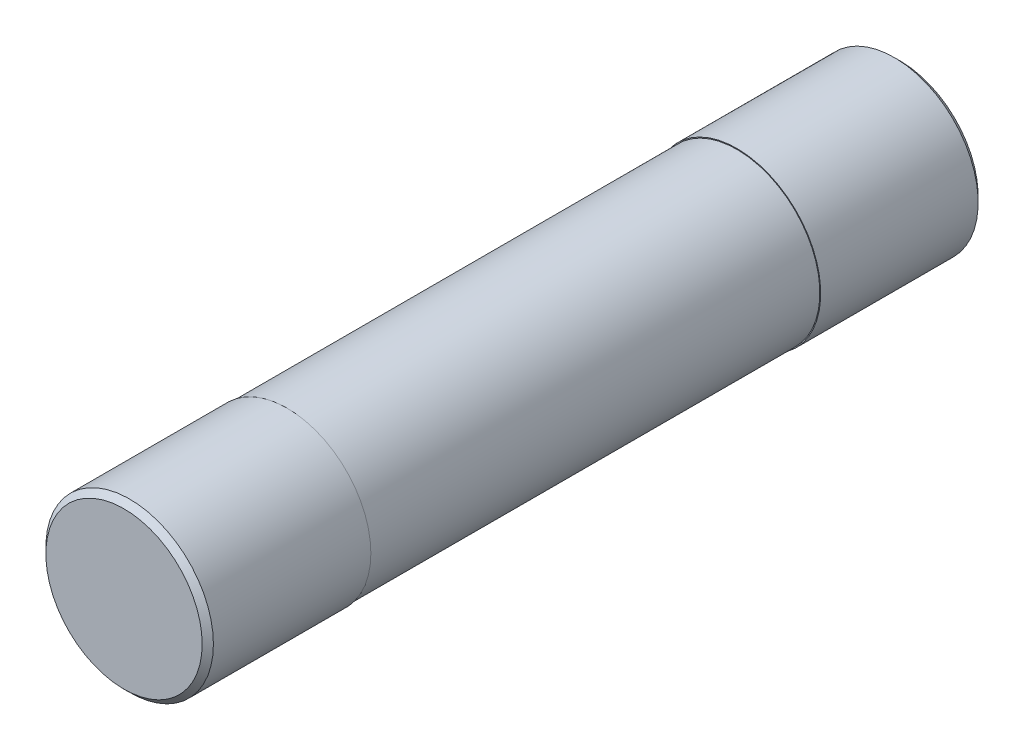
ISO-10303-21;
HEADER;
FILE_DESCRIPTION(('STEP AP214'),'2;1');
FILE_NAME('part.step','',(''),(''),'','','');
FILE_SCHEMA(('AUTOMOTIVE_DESIGN { 1 0 10303 214 1 1 1 1 }'));
ENDSEC;
DATA;
#1=APPLICATION_CONTEXT('core data for automotive mechanical design processes');
#2=APPLICATION_PROTOCOL_DEFINITION('international standard','automotive_design',2000,#1);
#3=PRODUCT_CONTEXT('',#1,'mechanical');
#4=PRODUCT('Part','Part','',(#3));
#5=PRODUCT_RELATED_PRODUCT_CATEGORY('part','',(#4));
#6=PRODUCT_DEFINITION_FORMATION('','',#4);
#7=PRODUCT_DEFINITION_CONTEXT('part definition',#1,'design');
#8=PRODUCT_DEFINITION('design','',#6,#7);
#9=PRODUCT_DEFINITION_SHAPE('','',#8);
#10=(LENGTH_UNIT() NAMED_UNIT(*) SI_UNIT(.MILLI.,.METRE.));
#11=(NAMED_UNIT(*) PLANE_ANGLE_UNIT() SI_UNIT($,.RADIAN.));
#12=(NAMED_UNIT(*) SI_UNIT($,.STERADIAN.) SOLID_ANGLE_UNIT());
#13=UNCERTAINTY_MEASURE_WITH_UNIT(LENGTH_MEASURE(1.E-05),#10,'distance_accuracy_value','');
#14=(GEOMETRIC_REPRESENTATION_CONTEXT(3) GLOBAL_UNCERTAINTY_ASSIGNED_CONTEXT((#13)) GLOBAL_UNIT_ASSIGNED_CONTEXT((#10,
#11,#12)) REPRESENTATION_CONTEXT('',''));
#15=CARTESIAN_POINT('',(0.,0.,0.));
#16=DIRECTION('',(0.,0.,1.));
#17=DIRECTION('',(1.,0.,0.));
#18=AXIS2_PLACEMENT_3D('',#15,#16,#17);
#19=CARTESIAN_POINT('',(0.,0.,8.));
#20=DIRECTION('',(0.,0.,-1.));
#21=DIRECTION('',(-1.,0.,0.));
#22=AXIS2_PLACEMENT_3D('',#19,#20,#21);
#23=CYLINDRICAL_SURFACE('',#22,1.475);
#24=CARTESIAN_POINT('',(0.,0.,8.));
#25=DIRECTION('',(0.,0.,1.));
#26=DIRECTION('',(1.,0.,0.));
#27=AXIS2_PLACEMENT_3D('',#24,#25,#26);
#28=CIRCLE('',#27,1.475);
#29=CARTESIAN_POINT('',(1.475,0.,8.));
#30=VERTEX_POINT('',#29);
#31=EDGE_CURVE('E51',#30,#30,#28,.T.);
#32=ORIENTED_EDGE('',*,*,#31,.F.);
#33=EDGE_LOOP('',(#32));
#34=FACE_BOUND('',#33,.T.);
#35=CARTESIAN_POINT('',(0.,0.,0.));
#36=DIRECTION('',(0.,0.,-1.));
#37=DIRECTION('',(-1.,0.,0.));
#38=AXIS2_PLACEMENT_3D('',#35,#36,#37);
#39=CIRCLE('',#38,1.475);
#40=CARTESIAN_POINT('',(-1.475,0.,0.));
#41=VERTEX_POINT('',#40);
#42=EDGE_CURVE('E54',#41,#41,#39,.T.);
#43=ORIENTED_EDGE('',*,*,#42,.F.);
#44=EDGE_LOOP('',(#43));
#45=FACE_BOUND('',#44,.T.);
#46=ADVANCED_FACE('F31',(#34,#45),#23,.T.);
#47=CARTESIAN_POINT('',(0.,0.,-2.9));
#48=DIRECTION('',(0.,0.,1.));
#49=DIRECTION('',(1.,0.,0.));
#50=AXIS2_PLACEMENT_3D('',#47,#48,#49);
#51=CYLINDRICAL_SURFACE('',#50,1.49);
#52=CARTESIAN_POINT('',(0.,0.,-2.8));
#53=DIRECTION('',(0.,0.,-1.));
#54=DIRECTION('',(-1.,0.,0.));
#55=AXIS2_PLACEMENT_3D('',#52,#53,#54);
#56=CIRCLE('',#55,1.49);
#57=CARTESIAN_POINT('',(-1.49,0.,-2.8));
#58=VERTEX_POINT('',#57);
#59=EDGE_CURVE('E10',#58,#58,#56,.F.);
#60=ORIENTED_EDGE('',*,*,#59,.T.);
#61=EDGE_LOOP('',(#60));
#62=FACE_BOUND('',#61,.T.);
#63=CARTESIAN_POINT('',(0.,0.,0.));
#64=DIRECTION('',(0.,0.,-1.));
#65=DIRECTION('',(-1.,0.,0.));
#66=AXIS2_PLACEMENT_3D('',#63,#64,#65);
#67=CIRCLE('',#66,1.49);
#68=CARTESIAN_POINT('',(-1.49,0.,0.));
#69=VERTEX_POINT('',#68);
#70=EDGE_CURVE('E57',#69,#69,#67,.T.);
#71=ORIENTED_EDGE('',*,*,#70,.T.);
#72=EDGE_LOOP('',(#71));
#73=FACE_BOUND('',#72,.T.);
#74=ADVANCED_FACE('F81',(#62,#73),#51,.T.);
#75=CARTESIAN_POINT('',(0.,0.,-2.9));
#76=DIRECTION('',(0.,0.,-1.));
#77=DIRECTION('',(-1.,0.,0.));
#78=AXIS2_PLACEMENT_3D('',#75,#76,#77);
#79=PLANE('',#78);
#80=CARTESIAN_POINT('',(0.,0.,-2.9));
#81=DIRECTION('',(0.,0.,-1.));
#82=DIRECTION('',(-1.,0.,0.));
#83=AXIS2_PLACEMENT_3D('',#80,#81,#82);
#84=CIRCLE('',#83,1.39);
#85=CARTESIAN_POINT('',(-1.39,0.,-2.9));
#86=VERTEX_POINT('',#85);
#87=EDGE_CURVE('E38',#86,#86,#84,.T.);
#88=ORIENTED_EDGE('',*,*,#87,.T.);
#89=EDGE_LOOP('',(#88));
#90=FACE_BOUND('',#89,.T.);
#91=ADVANCED_FACE('F87',(#90),#79,.T.);
#92=CARTESIAN_POINT('',(0.,0.,0.));
#93=DIRECTION('',(0.,0.,-1.));
#94=DIRECTION('',(-1.,0.,0.));
#95=AXIS2_PLACEMENT_3D('',#92,#93,#94);
#96=PLANE('',#95);
#97=ORIENTED_EDGE('',*,*,#42,.T.);
#98=EDGE_LOOP('',(#97));
#99=FACE_BOUND('',#98,.T.);
#100=ORIENTED_EDGE('',*,*,#70,.F.);
#101=EDGE_LOOP('',(#100));
#102=FACE_BOUND('',#101,.T.);
#103=ADVANCED_FACE('F92',(#99,#102),#96,.F.);
#104=CARTESIAN_POINT('',(0.,0.,10.9));
#105=DIRECTION('',(0.,0.,-1.));
#106=DIRECTION('',(-1.,0.,0.));
#107=AXIS2_PLACEMENT_3D('',#104,#105,#106);
#108=CYLINDRICAL_SURFACE('',#107,1.49);
#109=CARTESIAN_POINT('',(0.,0.,10.8));
#110=DIRECTION('',(0.,0.,1.));
#111=DIRECTION('',(1.,0.,0.));
#112=AXIS2_PLACEMENT_3D('',#109,#110,#111);
#113=CIRCLE('',#112,1.49);
#114=CARTESIAN_POINT('',(1.49,0.,10.8));
#115=VERTEX_POINT('',#114);
#116=EDGE_CURVE('E42',#115,#115,#113,.F.);
#117=ORIENTED_EDGE('',*,*,#116,.T.);
#118=EDGE_LOOP('',(#117));
#119=FACE_BOUND('',#118,.T.);
#120=CARTESIAN_POINT('',(0.,0.,8.));
#121=DIRECTION('',(0.,0.,1.));
#122=DIRECTION('',(1.,0.,0.));
#123=AXIS2_PLACEMENT_3D('',#120,#121,#122);
#124=CIRCLE('',#123,1.49);
#125=CARTESIAN_POINT('',(1.49,0.,8.));
#126=VERTEX_POINT('',#125);
#127=EDGE_CURVE('E60',#126,#126,#124,.T.);
#128=ORIENTED_EDGE('',*,*,#127,.T.);
#129=EDGE_LOOP('',(#128));
#130=FACE_BOUND('',#129,.T.);
#131=ADVANCED_FACE('F64',(#119,#130),#108,.T.);
#132=CARTESIAN_POINT('',(0.,0.,10.9));
#133=DIRECTION('',(0.,0.,1.));
#134=DIRECTION('',(1.,0.,0.));
#135=AXIS2_PLACEMENT_3D('',#132,#133,#134);
#136=PLANE('',#135);
#137=CARTESIAN_POINT('',(0.,0.,10.9));
#138=DIRECTION('',(0.,0.,1.));
#139=DIRECTION('',(1.,0.,0.));
#140=AXIS2_PLACEMENT_3D('',#137,#138,#139);
#141=CIRCLE('',#140,1.39);
#142=CARTESIAN_POINT('',(1.39,0.,10.9));
#143=VERTEX_POINT('',#142);
#144=EDGE_CURVE('E46',#143,#143,#141,.T.);
#145=ORIENTED_EDGE('',*,*,#144,.T.);
#146=EDGE_LOOP('',(#145));
#147=FACE_BOUND('',#146,.T.);
#148=ADVANCED_FACE('F69',(#147),#136,.T.);
#149=CARTESIAN_POINT('',(0.,0.,8.));
#150=DIRECTION('',(0.,0.,1.));
#151=DIRECTION('',(1.,0.,0.));
#152=AXIS2_PLACEMENT_3D('',#149,#150,#151);
#153=PLANE('',#152);
#154=ORIENTED_EDGE('',*,*,#31,.T.);
#155=EDGE_LOOP('',(#154));
#156=FACE_BOUND('',#155,.T.);
#157=ORIENTED_EDGE('',*,*,#127,.F.);
#158=EDGE_LOOP('',(#157));
#159=FACE_BOUND('',#158,.T.);
#160=ADVANCED_FACE('F66',(#156,#159),#153,.F.);
#161=CARTESIAN_POINT('',(0.,0.,10.9));
#162=DIRECTION('',(0.,0.,-1.));
#163=DIRECTION('',(-1.,0.,0.));
#164=AXIS2_PLACEMENT_3D('',#161,#162,#163);
#165=CONICAL_SURFACE('',#164,1.39,0.78539816339744);
#166=ORIENTED_EDGE('',*,*,#116,.F.);
#167=EDGE_LOOP('',(#166));
#168=FACE_BOUND('',#167,.T.);
#169=ORIENTED_EDGE('',*,*,#144,.F.);
#170=EDGE_LOOP('',(#169));
#171=FACE_BOUND('',#170,.T.);
#172=ADVANCED_FACE('F68',(#168,#171),#165,.T.);
#173=CARTESIAN_POINT('',(0.,0.,-2.9));
#174=DIRECTION('',(0.,0.,1.));
#175=DIRECTION('',(1.,0.,0.));
#176=AXIS2_PLACEMENT_3D('',#173,#174,#175);
#177=CONICAL_SURFACE('',#176,1.39,0.785398163397444);
#178=ORIENTED_EDGE('',*,*,#59,.F.);
#179=EDGE_LOOP('',(#178));
#180=FACE_BOUND('',#179,.T.);
#181=ORIENTED_EDGE('',*,*,#87,.F.);
#182=EDGE_LOOP('',(#181));
#183=FACE_BOUND('',#182,.T.);
#184=ADVANCED_FACE('F33',(#180,#183),#177,.T.);
#185=CLOSED_SHELL('',(#46,#74,#91,#103,#131,#148,#160,#172,#184));
#186=MANIFOLD_SOLID_BREP('B2',#185);
#187=ADVANCED_BREP_SHAPE_REPRESENTATION('',(#18,#186),#14);
#188=SHAPE_DEFINITION_REPRESENTATION(#9,#187);
ENDSEC;
END-ISO-10303-21;
